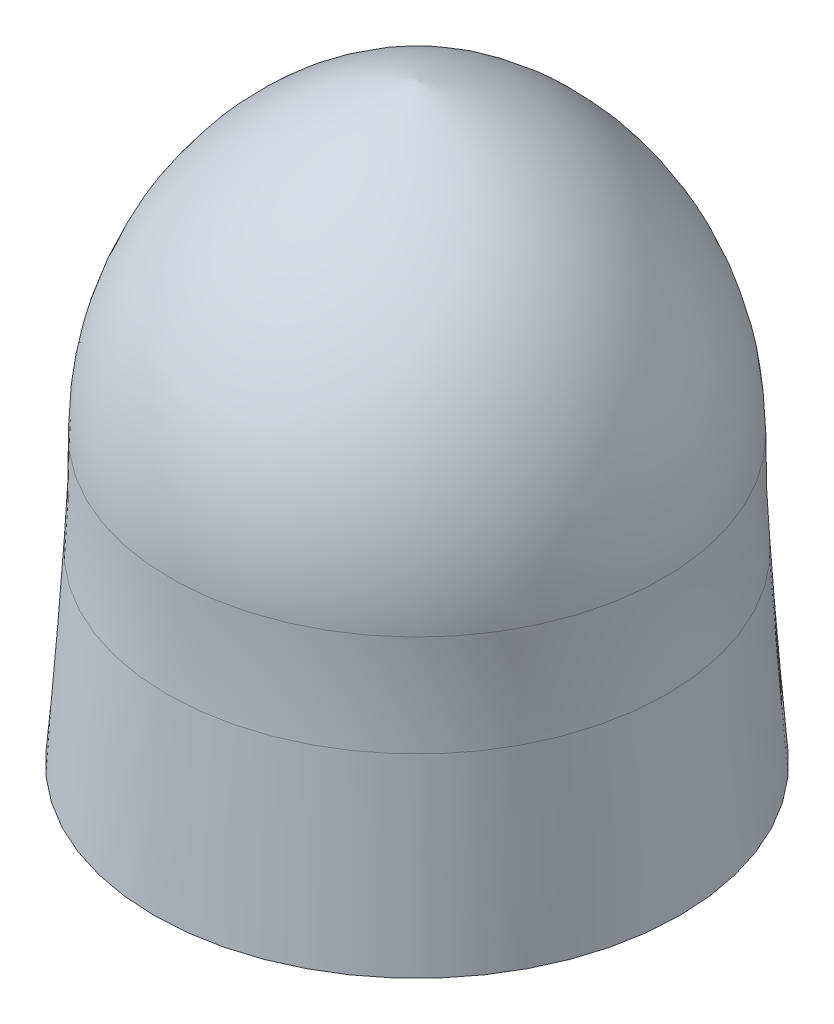
ISO-10303-21;
HEADER;
FILE_DESCRIPTION(('STEP AP214'),'2;1');
FILE_NAME('part.step','',(''),(''),'','','');
FILE_SCHEMA(('AUTOMOTIVE_DESIGN { 1 0 10303 214 1 1 1 1 }'));
ENDSEC;
DATA;
#1=APPLICATION_CONTEXT('core data for automotive mechanical design processes');
#2=APPLICATION_PROTOCOL_DEFINITION('international standard','automotive_design',2000,#1);
#3=PRODUCT_CONTEXT('',#1,'mechanical');
#4=PRODUCT('Part','Part','',(#3));
#5=PRODUCT_RELATED_PRODUCT_CATEGORY('part','',(#4));
#6=PRODUCT_DEFINITION_FORMATION('','',#4);
#7=PRODUCT_DEFINITION_CONTEXT('part definition',#1,'design');
#8=PRODUCT_DEFINITION('design','',#6,#7);
#9=PRODUCT_DEFINITION_SHAPE('','',#8);
#10=(LENGTH_UNIT() NAMED_UNIT(*) SI_UNIT(.MILLI.,.METRE.));
#11=(NAMED_UNIT(*) PLANE_ANGLE_UNIT() SI_UNIT($,.RADIAN.));
#12=(NAMED_UNIT(*) SI_UNIT($,.STERADIAN.) SOLID_ANGLE_UNIT());
#13=UNCERTAINTY_MEASURE_WITH_UNIT(LENGTH_MEASURE(1.E-05),#10,'distance_accuracy_value','');
#14=(GEOMETRIC_REPRESENTATION_CONTEXT(3) GLOBAL_UNCERTAINTY_ASSIGNED_CONTEXT((#13)) GLOBAL_UNIT_ASSIGNED_CONTEXT((#10,
#11,#12)) REPRESENTATION_CONTEXT('',''));
#15=CARTESIAN_POINT('',(0.,0.,0.));
#16=DIRECTION('',(0.,0.,1.));
#17=DIRECTION('',(1.,0.,0.));
#18=AXIS2_PLACEMENT_3D('',#15,#16,#17);
#19=CARTESIAN_POINT('',(10.,-46.48316129116,0.));
#20=DIRECTION('',(0.,0.,-1.));
#21=DIRECTION('',(-1.,0.,0.));
#22=AXIS2_PLACEMENT_3D('',#19,#20,#21);
#23=CIRCLE('',#22,47.5466537583876);
#24=TRIMMED_CURVE('',#23,(PARAMETER_VALUE(-1.35889432008498)),
(PARAMETER_VALUE(1.35889432008498)),.T.,.PARAMETER.);
#25=CARTESIAN_POINT('',(0.,-46.48316129116,0.));
#26=DIRECTION('',(0.,1.,0.));
#27=AXIS1_PLACEMENT('',#25,#26);
#28=SURFACE_OF_REVOLUTION('',#24,#27);
#29=CARTESIAN_POINT('',(0.,-46.7505656060775,0.));
#30=DIRECTION('',(0.,1.,0.));
#31=DIRECTION('',(-1.,0.,0.));
#32=AXIS2_PLACEMENT_3D('',#29,#30,#31);
#33=CIRCLE('',#32,37.545901806069);
#34=CARTESIAN_POINT('',(-37.545901806069,-46.7505656060775,0.));
#35=VERTEX_POINT('',#34);
#36=EDGE_CURVE('E44',#35,#35,#33,.T.);
#37=ORIENTED_EDGE('',*,*,#36,.T.);
#38=EDGE_LOOP('',(#37));
#39=FACE_BOUND('',#38,.T.);
#40=CARTESIAN_POINT('',(0.,0.,0.));
#41=VERTEX_POINT('',#40);
#42=VERTEX_LOOP('',#41);
#43=FACE_BOUND('',#42,.T.);
#44=ADVANCED_FACE('F37',(#39,#43),#28,.T.);
#45=CARTESIAN_POINT('',(0.,-51.3476055698832,0.));
#46=DIRECTION('',(0.,-1.,0.));
#47=DIRECTION('',(1.,0.,0.));
#48=AXIS2_PLACEMENT_3D('',#45,#46,#47);
#49=CONICAL_SURFACE('',#48,37.2971612835188,0.0698131700797734);
#50=CARTESIAN_POINT('',(0.,-61.8266684908287,0.));
#51=DIRECTION('',(0.,-1.,0.));
#52=DIRECTION('',(1.,0.,0.));
#53=AXIS2_PLACEMENT_3D('',#50,#51,#52);
#54=CIRCLE('',#53,38.029928745736);
#55=CARTESIAN_POINT('',(38.029928745736,-61.8266684908287,0.));
#56=VERTEX_POINT('',#55);
#57=EDGE_CURVE('E11',#56,#56,#54,.T.);
#58=ORIENTED_EDGE('',*,*,#57,.T.);
#59=EDGE_LOOP('',(#58));
#60=FACE_BOUND('',#59,.T.);
#61=CARTESIAN_POINT('',(0.,-90.,0.));
#62=DIRECTION('',(0.,1.,0.));
#63=DIRECTION('',(-1.,0.,0.));
#64=AXIS2_PLACEMENT_3D('',#61,#62,#63);
#65=CIRCLE('',#64,40.);
#66=CARTESIAN_POINT('',(-40.,-90.,0.));
#67=VERTEX_POINT('',#66);
#68=EDGE_CURVE('E66',#67,#67,#65,.T.);
#69=ORIENTED_EDGE('',*,*,#68,.T.);
#70=EDGE_LOOP('',(#69));
#71=FACE_BOUND('',#70,.T.);
#72=ADVANCED_FACE('F48',(#60,#71),#49,.T.);
#73=CARTESIAN_POINT('',(-40.,-90.,0.));
#74=DIRECTION('',(0.,-1.,0.));
#75=DIRECTION('',(1.,0.,0.));
#76=AXIS2_PLACEMENT_3D('',#73,#74,#75);
#77=PLANE('',#76);
#78=ORIENTED_EDGE('',*,*,#68,.F.);
#79=EDGE_LOOP('',(#78));
#80=FACE_BOUND('',#79,.T.);
#81=ADVANCED_FACE('F53',(#80),#77,.T.);
#82=CARTESIAN_POINT('',(0.,-47.8753737420037,0.));
#83=DIRECTION('',(0.,1.,0.));
#84=DIRECTION('',(-1.,0.,0.));
#85=AXIS2_PLACEMENT_3D('',#82,#83,#84);
#86=TOROIDAL_SURFACE('',#85,237.542738797701,200.);
#87=ORIENTED_EDGE('',*,*,#57,.F.);
#88=EDGE_LOOP('',(#87));
#89=FACE_BOUND('',#88,.T.);
#90=ORIENTED_EDGE('',*,*,#36,.F.);
#91=EDGE_LOOP('',(#90));
#92=FACE_BOUND('',#91,.T.);
#93=ADVANCED_FACE('F39',(#89,#92),#86,.F.);
#94=CLOSED_SHELL('',(#44,#72,#81,#93));
#95=MANIFOLD_SOLID_BREP('B2',#94);
#96=ADVANCED_BREP_SHAPE_REPRESENTATION('',(#18,#95),#14);
#97=SHAPE_DEFINITION_REPRESENTATION(#9,#96);
ENDSEC;
END-ISO-10303-21;
